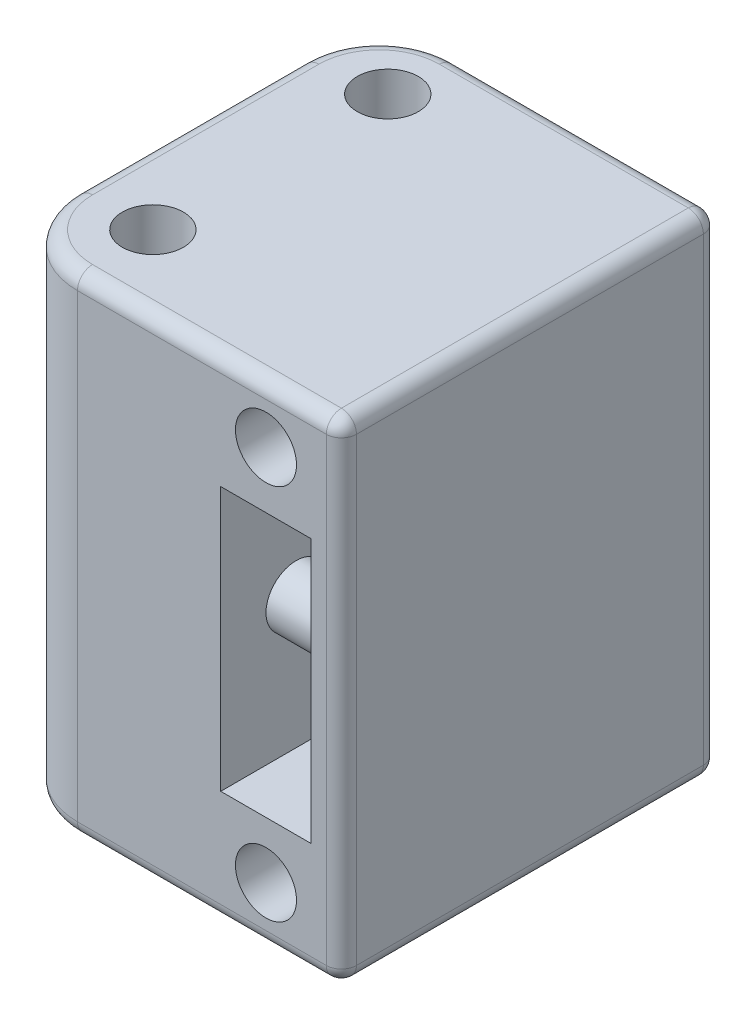
ISO-10303-21;
HEADER;
FILE_DESCRIPTION(('STEP AP214'),'2;1');
FILE_NAME('part.step','',(''),(''),'','','');
FILE_SCHEMA(('AUTOMOTIVE_DESIGN { 1 0 10303 214 1 1 1 1 }'));
ENDSEC;
DATA;
#1=APPLICATION_CONTEXT('core data for automotive mechanical design processes');
#2=APPLICATION_PROTOCOL_DEFINITION('international standard','automotive_design',2000,#1);
#3=PRODUCT_CONTEXT('',#1,'mechanical');
#4=PRODUCT('Part','Part','',(#3));
#5=PRODUCT_RELATED_PRODUCT_CATEGORY('part','',(#4));
#6=PRODUCT_DEFINITION_FORMATION('','',#4);
#7=PRODUCT_DEFINITION_CONTEXT('part definition',#1,'design');
#8=PRODUCT_DEFINITION('design','',#6,#7);
#9=PRODUCT_DEFINITION_SHAPE('','',#8);
#10=(LENGTH_UNIT() NAMED_UNIT(*) SI_UNIT(.MILLI.,.METRE.));
#11=(NAMED_UNIT(*) PLANE_ANGLE_UNIT() SI_UNIT($,.RADIAN.));
#12=(NAMED_UNIT(*) SI_UNIT($,.STERADIAN.) SOLID_ANGLE_UNIT());
#13=UNCERTAINTY_MEASURE_WITH_UNIT(LENGTH_MEASURE(1.E-05),#10,'distance_accuracy_value','');
#14=(GEOMETRIC_REPRESENTATION_CONTEXT(3) GLOBAL_UNCERTAINTY_ASSIGNED_CONTEXT((#13)) GLOBAL_UNIT_ASSIGNED_CONTEXT((#10,
#11,#12)) REPRESENTATION_CONTEXT('',''));
#15=CARTESIAN_POINT('',(0.,0.,0.));
#16=DIRECTION('',(0.,0.,1.));
#17=DIRECTION('',(1.,0.,0.));
#18=AXIS2_PLACEMENT_3D('',#15,#16,#17);
#19=CARTESIAN_POINT('',(0.,-65.,0.));
#20=DIRECTION('',(0.,1.,0.));
#21=DIRECTION('',(0.,0.,1.));
#22=AXIS2_PLACEMENT_3D('',#19,#20,#21);
#23=CYLINDRICAL_SURFACE('',#22,10.);
#24=DIRECTION('',(0.,1.,0.));
#25=VECTOR('',#24,1.);
#26=CARTESIAN_POINT('',(0.,-132.268120235369,-10.));
#27=LINE('',#26,#25);
#28=CARTESIAN_POINT('',(0.,-63.,-10.));
#29=VERTEX_POINT('',#28);
#30=CARTESIAN_POINT('',(0.,-9.99999999999998,-10.));
#31=VERTEX_POINT('',#30);
#32=EDGE_CURVE('E259',#29,#31,#27,.T.);
#33=ORIENTED_EDGE('',*,*,#32,.F.);
#34=CARTESIAN_POINT('',(0.,-63.,0.));
#35=DIRECTION('',(0.,1.,0.));
#36=DIRECTION('',(0.,0.,1.));
#37=AXIS2_PLACEMENT_3D('',#34,#35,#36);
#38=CIRCLE('',#37,10.);
#39=CARTESIAN_POINT('',(0.,-63.,10.));
#40=VERTEX_POINT('',#39);
#41=EDGE_CURVE('E312',#29,#40,#38,.T.);
#42=ORIENTED_EDGE('',*,*,#41,.T.);
#43=DIRECTION('',(0.,1.,0.));
#44=VECTOR('',#43,1.);
#45=CARTESIAN_POINT('',(0.,-10.,10.));
#46=LINE('',#45,#44);
#47=CARTESIAN_POINT('',(0.,-2.,10.));
#48=VERTEX_POINT('',#47);
#49=EDGE_CURVE('E270',#40,#48,#46,.T.);
#50=ORIENTED_EDGE('',*,*,#49,.T.);
#51=CARTESIAN_POINT('',(0.,-2.,0.));
#52=DIRECTION('',(0.,1.,0.));
#53=DIRECTION('',(0.,0.,1.));
#54=AXIS2_PLACEMENT_3D('',#51,#52,#53);
#55=CIRCLE('',#54,10.);
#56=CARTESIAN_POINT('',(-10.,-2.,0.));
#57=VERTEX_POINT('',#56);
#58=EDGE_CURVE('E310',#48,#57,#55,.F.);
#59=ORIENTED_EDGE('',*,*,#58,.T.);
#60=DIRECTION('',(0.,1.,0.));
#61=VECTOR('',#60,1.);
#62=CARTESIAN_POINT('',(-10.,-10.,0.));
#63=LINE('',#62,#61);
#64=CARTESIAN_POINT('',(-10.,-10.,0.));
#65=VERTEX_POINT('',#64);
#66=EDGE_CURVE('E271',#65,#57,#63,.T.);
#67=ORIENTED_EDGE('',*,*,#66,.F.);
#68=CARTESIAN_POINT('',(0.,-10.,0.));
#69=DIRECTION('',(0.,1.,0.));
#70=DIRECTION('',(0.,0.,1.));
#71=AXIS2_PLACEMENT_3D('',#68,#69,#70);
#72=CIRCLE('',#71,10.);
#73=EDGE_CURVE('E274',#65,#31,#72,.F.);
#74=ORIENTED_EDGE('',*,*,#73,.T.);
#75=EDGE_LOOP('',(#33,#42,#50,#59,#67,#74));
#76=FACE_BOUND('',#75,.T.);
#77=ADVANCED_FACE('F56',(#76),#23,.T.);
#78=CARTESIAN_POINT('',(0.,-65.,0.));
#79=DIRECTION('',(0.,1.,0.));
#80=DIRECTION('',(0.,0.,1.));
#81=AXIS2_PLACEMENT_3D('',#78,#79,#80);
#82=PLANE('',#81);
#83=DIRECTION('',(0.,0.,-1.));
#84=VECTOR('',#83,1.);
#85=CARTESIAN_POINT('',(17.,-65.,-39.9999999999999));
#86=LINE('',#85,#84);
#87=CARTESIAN_POINT('',(17.,-65.,-8.00000000000001));
#88=VERTEX_POINT('',#87);
#89=CARTESIAN_POINT('',(17.,-65.,-37.9999999999999));
#90=VERTEX_POINT('',#89);
#91=EDGE_CURVE('E303',#88,#90,#86,.T.);
#92=ORIENTED_EDGE('',*,*,#91,.T.);
#93=DIRECTION('',(1.,0.,0.));
#94=VECTOR('',#93,1.);
#95=CARTESIAN_POINT('',(35.,-65.,-38.));
#96=LINE('',#95,#94);
#97=CARTESIAN_POINT('',(33.,-65.,-38.));
#98=VERTEX_POINT('',#97);
#99=EDGE_CURVE('E305',#90,#98,#96,.T.);
#100=ORIENTED_EDGE('',*,*,#99,.T.);
#101=DIRECTION('',(0.,0.,1.));
#102=VECTOR('',#101,1.);
#103=CARTESIAN_POINT('',(33.,-65.,10.));
#104=LINE('',#103,#102);
#105=CARTESIAN_POINT('',(33.,-65.,8.00000000000001));
#106=VERTEX_POINT('',#105);
#107=EDGE_CURVE('E296',#98,#106,#104,.T.);
#108=ORIENTED_EDGE('',*,*,#107,.T.);
#109=DIRECTION('',(-1.,0.,0.));
#110=VECTOR('',#109,1.);
#111=CARTESIAN_POINT('',(0.,-65.,8.00000000000001));
#112=LINE('',#111,#110);
#113=CARTESIAN_POINT('',(0.,-65.,8.00000000000001));
#114=VERTEX_POINT('',#113);
#115=EDGE_CURVE('E294',#106,#114,#112,.T.);
#116=ORIENTED_EDGE('',*,*,#115,.T.);
#117=CARTESIAN_POINT('',(0.,-65.,0.));
#118=DIRECTION('',(0.,1.,0.));
#119=DIRECTION('',(0.,0.,1.));
#120=AXIS2_PLACEMENT_3D('',#117,#118,#119);
#121=CIRCLE('',#120,8.);
#122=CARTESIAN_POINT('',(0.,-65.,-8.00000000000001));
#123=VERTEX_POINT('',#122);
#124=EDGE_CURVE('E298',#114,#123,#121,.F.);
#125=ORIENTED_EDGE('',*,*,#124,.T.);
#126=DIRECTION('',(1.,0.,0.));
#127=VECTOR('',#126,1.);
#128=CARTESIAN_POINT('',(15.,-65.,-8.00000000000001));
#129=LINE('',#128,#127);
#130=EDGE_CURVE('E300',#123,#88,#129,.T.);
#131=ORIENTED_EDGE('',*,*,#130,.T.);
#132=EDGE_LOOP('',(#92,#100,#108,#116,#125,#131));
#133=FACE_BOUND('',#132,.T.);
#134=CARTESIAN_POINT('',(0.,-65.,0.));
#135=DIRECTION('',(0.,1.,0.));
#136=DIRECTION('',(0.,0.,1.));
#137=AXIS2_PLACEMENT_3D('',#134,#135,#136);
#138=CIRCLE('',#137,4.05);
#139=CARTESIAN_POINT('',(0.,-65.,4.05));
#140=VERTEX_POINT('',#139);
#141=EDGE_CURVE('E248',#140,#140,#138,.T.);
#142=ORIENTED_EDGE('',*,*,#141,.T.);
#143=EDGE_LOOP('',(#142));
#144=FACE_BOUND('',#143,.T.);
#145=ADVANCED_FACE('F425',(#133,#144),#82,.F.);
#146=CARTESIAN_POINT('',(0.,0.,0.));
#147=DIRECTION('',(0.,1.,0.));
#148=DIRECTION('',(0.,0.,1.));
#149=AXIS2_PLACEMENT_3D('',#146,#147,#148);
#150=PLANE('',#149);
#151=DIRECTION('',(0.,0.,-1.));
#152=VECTOR('',#151,1.);
#153=CARTESIAN_POINT('',(33.,0.,0.));
#154=LINE('',#153,#152);
#155=CARTESIAN_POINT('',(33.,0.,8.00000000000001));
#156=VERTEX_POINT('',#155);
#157=CARTESIAN_POINT('',(33.,0.,-38.));
#158=VERTEX_POINT('',#157);
#159=EDGE_CURVE('E314',#156,#158,#154,.T.);
#160=ORIENTED_EDGE('',*,*,#159,.T.);
#161=DIRECTION('',(-1.,0.,0.));
#162=VECTOR('',#161,1.);
#163=CARTESIAN_POINT('',(0.,0.,-38.));
#164=LINE('',#163,#162);
#165=CARTESIAN_POINT('',(0.,0.,-38.));
#166=VERTEX_POINT('',#165);
#167=EDGE_CURVE('E324',#158,#166,#164,.T.);
#168=ORIENTED_EDGE('',*,*,#167,.T.);
#169=CARTESIAN_POINT('',(0.,0.,-30.));
#170=DIRECTION('',(0.,1.,0.));
#171=DIRECTION('',(0.,0.,1.));
#172=AXIS2_PLACEMENT_3D('',#169,#170,#171);
#173=CIRCLE('',#172,8.);
#174=CARTESIAN_POINT('',(-8.,0.,-30.));
#175=VERTEX_POINT('',#174);
#176=EDGE_CURVE('E322',#166,#175,#173,.T.);
#177=ORIENTED_EDGE('',*,*,#176,.T.);
#178=DIRECTION('',(0.,0.,1.));
#179=VECTOR('',#178,1.);
#180=CARTESIAN_POINT('',(-8.,0.,0.));
#181=LINE('',#180,#179);
#182=CARTESIAN_POINT('',(-8.,0.,0.));
#183=VERTEX_POINT('',#182);
#184=EDGE_CURVE('E320',#175,#183,#181,.T.);
#185=ORIENTED_EDGE('',*,*,#184,.T.);
#186=CARTESIAN_POINT('',(0.,0.,0.));
#187=DIRECTION('',(0.,1.,0.));
#188=DIRECTION('',(0.,0.,1.));
#189=AXIS2_PLACEMENT_3D('',#186,#187,#188);
#190=CIRCLE('',#189,8.);
#191=CARTESIAN_POINT('',(0.,0.,8.00000000000001));
#192=VERTEX_POINT('',#191);
#193=EDGE_CURVE('E318',#183,#192,#190,.T.);
#194=ORIENTED_EDGE('',*,*,#193,.T.);
#195=DIRECTION('',(1.,0.,0.));
#196=VECTOR('',#195,1.);
#197=CARTESIAN_POINT('',(0.,0.,8.00000000000001));
#198=LINE('',#197,#196);
#199=EDGE_CURVE('E316',#192,#156,#198,.T.);
#200=ORIENTED_EDGE('',*,*,#199,.T.);
#201=EDGE_LOOP('',(#160,#168,#177,#185,#194,#200));
#202=FACE_BOUND('',#201,.T.);
#203=CARTESIAN_POINT('',(0.,0.,0.));
#204=DIRECTION('',(0.,1.,0.));
#205=DIRECTION('',(0.,0.,1.));
#206=AXIS2_PLACEMENT_3D('',#203,#204,#205);
#207=CIRCLE('',#206,4.05);
#208=CARTESIAN_POINT('',(0.,0.,4.05));
#209=VERTEX_POINT('',#208);
#210=EDGE_CURVE('E252',#209,#209,#207,.T.);
#211=ORIENTED_EDGE('',*,*,#210,.F.);
#212=EDGE_LOOP('',(#211));
#213=FACE_BOUND('',#212,.T.);
#214=CARTESIAN_POINT('',(0.,0.,-31.15));
#215=DIRECTION('',(0.,1.,0.));
#216=DIRECTION('',(0.,0.,1.));
#217=AXIS2_PLACEMENT_3D('',#214,#215,#216);
#218=CIRCLE('',#217,4.05);
#219=CARTESIAN_POINT('',(0.,0.,-27.1));
#220=VERTEX_POINT('',#219);
#221=EDGE_CURVE('E255',#220,#220,#218,.T.);
#222=ORIENTED_EDGE('',*,*,#221,.F.);
#223=EDGE_LOOP('',(#222));
#224=FACE_BOUND('',#223,.T.);
#225=ADVANCED_FACE('F431',(#202,#213,#224),#150,.T.);
#226=CARTESIAN_POINT('',(-10.,-10.,0.));
#227=DIRECTION('',(-1.,0.,0.));
#228=DIRECTION('',(0.,0.,1.));
#229=AXIS2_PLACEMENT_3D('',#226,#227,#228);
#230=PLANE('',#229);
#231=ORIENTED_EDGE('',*,*,#66,.T.);
#232=DIRECTION('',(0.,0.,1.));
#233=VECTOR('',#232,1.);
#234=CARTESIAN_POINT('',(-10.,-2.,0.));
#235=LINE('',#234,#233);
#236=CARTESIAN_POINT('',(-10.,-2.,-30.));
#237=VERTEX_POINT('',#236);
#238=EDGE_CURVE('E335',#57,#237,#235,.F.);
#239=ORIENTED_EDGE('',*,*,#238,.T.);
#240=DIRECTION('',(0.,1.,0.));
#241=VECTOR('',#240,1.);
#242=CARTESIAN_POINT('',(-10.,-10.,-30.));
#243=LINE('',#242,#241);
#244=CARTESIAN_POINT('',(-10.,-10.,-30.));
#245=VERTEX_POINT('',#244);
#246=EDGE_CURVE('E290',#237,#245,#243,.F.);
#247=ORIENTED_EDGE('',*,*,#246,.T.);
#248=DIRECTION('',(0.,0.,1.));
#249=VECTOR('',#248,1.);
#250=CARTESIAN_POINT('',(-10.,-10.,0.));
#251=LINE('',#250,#249);
#252=EDGE_CURVE('E268',#245,#65,#251,.T.);
#253=ORIENTED_EDGE('',*,*,#252,.T.);
#254=EDGE_LOOP('',(#231,#239,#247,#253));
#255=FACE_BOUND('',#254,.T.);
#256=ADVANCED_FACE('F523',(#255),#230,.T.);
#257=CARTESIAN_POINT('',(-10.,-10.,-40.));
#258=DIRECTION('',(0.,0.,-1.));
#259=DIRECTION('',(-1.,0.,0.));
#260=AXIS2_PLACEMENT_3D('',#257,#258,#259);
#261=PLANE('',#260);
#262=DIRECTION('',(1.,0.,0.));
#263=VECTOR('',#262,1.);
#264=CARTESIAN_POINT('',(19.,-15.,-40.));
#265=LINE('',#264,#263);
#266=CARTESIAN_POINT('',(19.,-15.,-40.));
#267=VERTEX_POINT('',#266);
#268=CARTESIAN_POINT('',(31.,-15.,-39.9999999999999));
#269=VERTEX_POINT('',#268);
#270=EDGE_CURVE('E71',#267,#269,#265,.T.);
#271=ORIENTED_EDGE('',*,*,#270,.F.);
#272=DIRECTION('',(0.,1.,0.));
#273=VECTOR('',#272,1.);
#274=CARTESIAN_POINT('',(19.,-50.,-40.));
#275=LINE('',#274,#273);
#276=CARTESIAN_POINT('',(19.,-50.,-40.));
#277=VERTEX_POINT('',#276);
#278=EDGE_CURVE('E217',#277,#267,#275,.T.);
#279=ORIENTED_EDGE('',*,*,#278,.F.);
#280=DIRECTION('',(-1.,0.,0.));
#281=VECTOR('',#280,1.);
#282=CARTESIAN_POINT('',(31.,-50.,-39.9999999999999));
#283=LINE('',#282,#281);
#284=CARTESIAN_POINT('',(31.,-50.,-39.9999999999999));
#285=VERTEX_POINT('',#284);
#286=EDGE_CURVE('E220',#285,#277,#283,.T.);
#287=ORIENTED_EDGE('',*,*,#286,.F.);
#288=DIRECTION('',(0.,-1.,0.));
#289=VECTOR('',#288,1.);
#290=CARTESIAN_POINT('',(31.,-15.,-39.9999999999999));
#291=LINE('',#290,#289);
#292=EDGE_CURVE('E226',#269,#285,#291,.T.);
#293=ORIENTED_EDGE('',*,*,#292,.F.);
#294=EDGE_LOOP('',(#271,#279,#287,#293));
#295=FACE_BOUND('',#294,.T.);
#296=CARTESIAN_POINT('',(24.9990855474541,-57.5,-40.));
#297=DIRECTION('',(0.,0.,-1.));
#298=DIRECTION('',(-1.,0.,0.));
#299=AXIS2_PLACEMENT_3D('',#296,#297,#298);
#300=CIRCLE('',#299,4.05);
#301=CARTESIAN_POINT('',(20.9490855474541,-57.5,-40.));
#302=VERTEX_POINT('',#301);
#303=EDGE_CURVE('E244',#302,#302,#300,.T.);
#304=ORIENTED_EDGE('',*,*,#303,.F.);
#305=EDGE_LOOP('',(#304));
#306=FACE_BOUND('',#305,.T.);
#307=CARTESIAN_POINT('',(24.9990855474541,-7.50000000000001,-40.));
#308=DIRECTION('',(0.,0.,-1.));
#309=DIRECTION('',(-1.,0.,0.));
#310=AXIS2_PLACEMENT_3D('',#307,#308,#309);
#311=CIRCLE('',#310,4.05);
#312=CARTESIAN_POINT('',(20.9490855474541,-7.50000000000001,-40.));
#313=VERTEX_POINT('',#312);
#314=EDGE_CURVE('E239',#313,#313,#311,.T.);
#315=ORIENTED_EDGE('',*,*,#314,.F.);
#316=EDGE_LOOP('',(#315));
#317=FACE_BOUND('',#316,.T.);
#318=DIRECTION('',(0.,1.,0.));
#319=VECTOR('',#318,1.);
#320=CARTESIAN_POINT('',(0.,-10.,-40.));
#321=LINE('',#320,#319);
#322=CARTESIAN_POINT('',(0.,-10.,-40.));
#323=VERTEX_POINT('',#322);
#324=CARTESIAN_POINT('',(0.,-2.,-40.));
#325=VERTEX_POINT('',#324);
#326=EDGE_CURVE('E285',#323,#325,#321,.T.);
#327=ORIENTED_EDGE('',*,*,#326,.T.);
#328=DIRECTION('',(-1.,0.,0.));
#329=VECTOR('',#328,1.);
#330=CARTESIAN_POINT('',(-10.,-2.,-40.));
#331=LINE('',#330,#329);
#332=CARTESIAN_POINT('',(33.,-2.,-40.));
#333=VERTEX_POINT('',#332);
#334=EDGE_CURVE('E331',#325,#333,#331,.F.);
#335=ORIENTED_EDGE('',*,*,#334,.T.);
#336=DIRECTION('',(0.,1.,0.));
#337=VECTOR('',#336,1.);
#338=CARTESIAN_POINT('',(33.,-10.,-40.));
#339=LINE('',#338,#337);
#340=CARTESIAN_POINT('',(33.,-63.,-40.));
#341=VERTEX_POINT('',#340);
#342=EDGE_CURVE('E329',#333,#341,#339,.F.);
#343=ORIENTED_EDGE('',*,*,#342,.T.);
#344=DIRECTION('',(1.,0.,0.));
#345=VECTOR('',#344,1.);
#346=CARTESIAN_POINT('',(15.,-63.,-40.));
#347=LINE('',#346,#345);
#348=CARTESIAN_POINT('',(15.,-63.,-39.9999999999999));
#349=VERTEX_POINT('',#348);
#350=EDGE_CURVE('E327',#341,#349,#347,.F.);
#351=ORIENTED_EDGE('',*,*,#350,.T.);
#352=DIRECTION('',(0.,1.,0.));
#353=VECTOR('',#352,1.);
#354=CARTESIAN_POINT('',(15.,-132.268120235369,-39.9999999999999));
#355=LINE('',#354,#353);
#356=CARTESIAN_POINT('',(15.,-9.99999999999998,-39.9999999999999));
#357=VERTEX_POINT('',#356);
#358=EDGE_CURVE('E264',#349,#357,#355,.T.);
#359=ORIENTED_EDGE('',*,*,#358,.T.);
#360=DIRECTION('',(-1.,0.,0.));
#361=VECTOR('',#360,1.);
#362=CARTESIAN_POINT('',(-10.,-10.,-40.));
#363=LINE('',#362,#361);
#364=EDGE_CURVE('E261',#357,#323,#363,.T.);
#365=ORIENTED_EDGE('',*,*,#364,.T.);
#366=EDGE_LOOP('',(#327,#335,#343,#351,#359,#365));
#367=FACE_BOUND('',#366,.T.);
#368=ADVANCED_FACE('F533',(#295,#306,#317,#367),#261,.T.);
#369=CARTESIAN_POINT('',(35.,-10.,-40.));
#370=DIRECTION('',(1.,0.,0.));
#371=DIRECTION('',(0.,0.,-1.));
#372=AXIS2_PLACEMENT_3D('',#369,#370,#371);
#373=PLANE('',#372);
#374=DIRECTION('',(0.,0.,1.));
#375=VECTOR('',#374,1.);
#376=CARTESIAN_POINT('',(35.,-63.,-40.));
#377=LINE('',#376,#375);
#378=CARTESIAN_POINT('',(35.,-63.,8.00000000000001));
#379=VERTEX_POINT('',#378);
#380=CARTESIAN_POINT('',(35.,-63.,-38.));
#381=VERTEX_POINT('',#380);
#382=EDGE_CURVE('E341',#379,#381,#377,.F.);
#383=ORIENTED_EDGE('',*,*,#382,.T.);
#384=DIRECTION('',(0.,1.,0.));
#385=VECTOR('',#384,1.);
#386=CARTESIAN_POINT('',(35.,-10.,-38.));
#387=LINE('',#386,#385);
#388=CARTESIAN_POINT('',(35.,-2.,-38.));
#389=VERTEX_POINT('',#388);
#390=EDGE_CURVE('E343',#381,#389,#387,.T.);
#391=ORIENTED_EDGE('',*,*,#390,.T.);
#392=DIRECTION('',(0.,0.,-1.));
#393=VECTOR('',#392,1.);
#394=CARTESIAN_POINT('',(35.,-2.,-40.));
#395=LINE('',#394,#393);
#396=CARTESIAN_POINT('',(35.,-2.,8.00000000000001));
#397=VERTEX_POINT('',#396);
#398=EDGE_CURVE('E339',#389,#397,#395,.F.);
#399=ORIENTED_EDGE('',*,*,#398,.T.);
#400=DIRECTION('',(0.,1.,0.));
#401=VECTOR('',#400,1.);
#402=CARTESIAN_POINT('',(35.,-10.,8.00000000000001));
#403=LINE('',#402,#401);
#404=EDGE_CURVE('E337',#397,#379,#403,.F.);
#405=ORIENTED_EDGE('',*,*,#404,.T.);
#406=EDGE_LOOP('',(#383,#391,#399,#405));
#407=FACE_BOUND('',#406,.T.);
#408=ADVANCED_FACE('F604',(#407),#373,.T.);
#409=CARTESIAN_POINT('',(0.,-10.,10.));
#410=DIRECTION('',(0.,0.,1.));
#411=DIRECTION('',(1.,0.,0.));
#412=AXIS2_PLACEMENT_3D('',#409,#410,#411);
#413=PLANE('',#412);
#414=DIRECTION('',(1.,0.,0.));
#415=VECTOR('',#414,1.);
#416=CARTESIAN_POINT('',(19.,-15.,10.));
#417=LINE('',#416,#415);
#418=CARTESIAN_POINT('',(19.,-15.,10.));
#419=VERTEX_POINT('',#418);
#420=CARTESIAN_POINT('',(31.,-15.,10.));
#421=VERTEX_POINT('',#420);
#422=EDGE_CURVE('E201',#419,#421,#417,.T.);
#423=ORIENTED_EDGE('',*,*,#422,.T.);
#424=DIRECTION('',(0.,-1.,0.));
#425=VECTOR('',#424,1.);
#426=CARTESIAN_POINT('',(31.,-15.,10.));
#427=LINE('',#426,#425);
#428=CARTESIAN_POINT('',(31.,-50.,10.));
#429=VERTEX_POINT('',#428);
#430=EDGE_CURVE('E210',#421,#429,#427,.T.);
#431=ORIENTED_EDGE('',*,*,#430,.T.);
#432=DIRECTION('',(-1.,0.,0.));
#433=VECTOR('',#432,1.);
#434=CARTESIAN_POINT('',(31.,-50.,10.));
#435=LINE('',#434,#433);
#436=CARTESIAN_POINT('',(19.,-50.,10.));
#437=VERTEX_POINT('',#436);
#438=EDGE_CURVE('E79',#429,#437,#435,.T.);
#439=ORIENTED_EDGE('',*,*,#438,.T.);
#440=DIRECTION('',(0.,1.,0.));
#441=VECTOR('',#440,1.);
#442=CARTESIAN_POINT('',(19.,-50.,10.));
#443=LINE('',#442,#441);
#444=EDGE_CURVE('E207',#437,#419,#443,.T.);
#445=ORIENTED_EDGE('',*,*,#444,.T.);
#446=EDGE_LOOP('',(#423,#431,#439,#445));
#447=FACE_BOUND('',#446,.T.);
#448=CARTESIAN_POINT('',(24.9990855474541,-57.5,9.9999999999999));
#449=DIRECTION('',(0.,0.,-1.));
#450=DIRECTION('',(-1.,0.,0.));
#451=AXIS2_PLACEMENT_3D('',#448,#449,#450);
#452=CIRCLE('',#451,4.05);
#453=CARTESIAN_POINT('',(20.9490855474541,-57.5,9.9999999999999));
#454=VERTEX_POINT('',#453);
#455=EDGE_CURVE('E236',#454,#454,#452,.T.);
#456=ORIENTED_EDGE('',*,*,#455,.T.);
#457=EDGE_LOOP('',(#456));
#458=FACE_BOUND('',#457,.T.);
#459=CARTESIAN_POINT('',(24.9990855474541,-7.50000000000001,9.9999999999999));
#460=DIRECTION('',(0.,0.,-1.));
#461=DIRECTION('',(-1.,0.,0.));
#462=AXIS2_PLACEMENT_3D('',#459,#460,#461);
#463=CIRCLE('',#462,4.05);
#464=CARTESIAN_POINT('',(20.9490855474541,-7.50000000000001,9.9999999999999));
#465=VERTEX_POINT('',#464);
#466=EDGE_CURVE('E232',#465,#465,#463,.T.);
#467=ORIENTED_EDGE('',*,*,#466,.T.);
#468=EDGE_LOOP('',(#467));
#469=FACE_BOUND('',#468,.T.);
#470=ORIENTED_EDGE('',*,*,#49,.F.);
#471=DIRECTION('',(-1.,0.,0.));
#472=VECTOR('',#471,1.);
#473=CARTESIAN_POINT('',(35.,-63.,10.));
#474=LINE('',#473,#472);
#475=CARTESIAN_POINT('',(33.,-63.,10.));
#476=VERTEX_POINT('',#475);
#477=EDGE_CURVE('E352',#40,#476,#474,.F.);
#478=ORIENTED_EDGE('',*,*,#477,.T.);
#479=DIRECTION('',(0.,1.,0.));
#480=VECTOR('',#479,1.);
#481=CARTESIAN_POINT('',(33.,-10.,10.));
#482=LINE('',#481,#480);
#483=CARTESIAN_POINT('',(33.,-2.,10.));
#484=VERTEX_POINT('',#483);
#485=EDGE_CURVE('E348',#476,#484,#482,.T.);
#486=ORIENTED_EDGE('',*,*,#485,.T.);
#487=DIRECTION('',(1.,0.,0.));
#488=VECTOR('',#487,1.);
#489=CARTESIAN_POINT('',(0.,-2.,10.));
#490=LINE('',#489,#488);
#491=EDGE_CURVE('E350',#484,#48,#490,.F.);
#492=ORIENTED_EDGE('',*,*,#491,.T.);
#493=EDGE_LOOP('',(#470,#478,#486,#492));
#494=FACE_BOUND('',#493,.T.);
#495=ADVANCED_FACE('F214',(#447,#458,#469,#494),#413,.T.);
#496=CARTESIAN_POINT('',(0.,-10.,0.));
#497=DIRECTION('',(0.,1.,0.));
#498=DIRECTION('',(0.,0.,1.));
#499=AXIS2_PLACEMENT_3D('',#496,#497,#498);
#500=PLANE('',#499);
#501=CARTESIAN_POINT('',(0.,-10.,-31.15));
#502=DIRECTION('',(0.,1.,0.));
#503=DIRECTION('',(0.,0.,1.));
#504=AXIS2_PLACEMENT_3D('',#501,#502,#503);
#505=CIRCLE('',#504,4.05);
#506=CARTESIAN_POINT('',(0.,-10.,-27.1));
#507=VERTEX_POINT('',#506);
#508=EDGE_CURVE('E251',#507,#507,#505,.T.);
#509=ORIENTED_EDGE('',*,*,#508,.T.);
#510=EDGE_LOOP('',(#509));
#511=FACE_BOUND('',#510,.T.);
#512=ORIENTED_EDGE('',*,*,#252,.F.);
#513=CARTESIAN_POINT('',(0.,-10.,-30.));
#514=DIRECTION('',(0.,1.,0.));
#515=DIRECTION('',(0.,0.,1.));
#516=AXIS2_PLACEMENT_3D('',#513,#514,#515);
#517=CIRCLE('',#516,10.);
#518=EDGE_CURVE('E292',#245,#323,#517,.F.);
#519=ORIENTED_EDGE('',*,*,#518,.T.);
#520=ORIENTED_EDGE('',*,*,#364,.F.);
#521=DIRECTION('',(0.,0.,1.));
#522=VECTOR('',#521,1.);
#523=CARTESIAN_POINT('',(15.,-10.,0.));
#524=LINE('',#523,#522);
#525=CARTESIAN_POINT('',(15.,-9.99999999999998,-10.));
#526=VERTEX_POINT('',#525);
#527=EDGE_CURVE('E279',#357,#526,#524,.T.);
#528=ORIENTED_EDGE('',*,*,#527,.T.);
#529=DIRECTION('',(-1.,0.,0.));
#530=VECTOR('',#529,1.);
#531=CARTESIAN_POINT('',(0.,-10.,-10.));
#532=LINE('',#531,#530);
#533=EDGE_CURVE('E282',#526,#31,#532,.T.);
#534=ORIENTED_EDGE('',*,*,#533,.T.);
#535=ORIENTED_EDGE('',*,*,#73,.F.);
#536=EDGE_LOOP('',(#512,#519,#520,#528,#534,#535));
#537=FACE_BOUND('',#536,.T.);
#538=ADVANCED_FACE('F530',(#511,#537),#500,.F.);
#539=CARTESIAN_POINT('',(0.,-132.268120235369,-10.));
#540=DIRECTION('',(0.,0.,-1.));
#541=DIRECTION('',(-1.,0.,0.));
#542=AXIS2_PLACEMENT_3D('',#539,#540,#541);
#543=PLANE('',#542);
#544=DIRECTION('',(0.,1.,0.));
#545=VECTOR('',#544,1.);
#546=CARTESIAN_POINT('',(15.,-132.268120235369,-10.));
#547=LINE('',#546,#545);
#548=CARTESIAN_POINT('',(15.,-63.,-10.));
#549=VERTEX_POINT('',#548);
#550=EDGE_CURVE('E262',#549,#526,#547,.T.);
#551=ORIENTED_EDGE('',*,*,#550,.F.);
#552=DIRECTION('',(1.,0.,0.));
#553=VECTOR('',#552,1.);
#554=CARTESIAN_POINT('',(0.,-63.,-10.));
#555=LINE('',#554,#553);
#556=EDGE_CURVE('E307',#549,#29,#555,.F.);
#557=ORIENTED_EDGE('',*,*,#556,.T.);
#558=ORIENTED_EDGE('',*,*,#32,.T.);
#559=ORIENTED_EDGE('',*,*,#533,.F.);
#560=EDGE_LOOP('',(#551,#557,#558,#559));
#561=FACE_BOUND('',#560,.T.);
#562=ADVANCED_FACE('F586',(#561),#543,.T.);
#563=CARTESIAN_POINT('',(15.,-132.268120235369,-39.9999999999999));
#564=DIRECTION('',(-1.,0.,0.));
#565=DIRECTION('',(0.,0.,1.));
#566=AXIS2_PLACEMENT_3D('',#563,#564,#565);
#567=PLANE('',#566);
#568=ORIENTED_EDGE('',*,*,#358,.F.);
#569=DIRECTION('',(0.,0.,-1.));
#570=VECTOR('',#569,1.);
#571=CARTESIAN_POINT('',(15.,-63.,-10.));
#572=LINE('',#571,#570);
#573=EDGE_CURVE('E346',#349,#549,#572,.F.);
#574=ORIENTED_EDGE('',*,*,#573,.T.);
#575=ORIENTED_EDGE('',*,*,#550,.T.);
#576=ORIENTED_EDGE('',*,*,#527,.F.);
#577=EDGE_LOOP('',(#568,#574,#575,#576));
#578=FACE_BOUND('',#577,.T.);
#579=ADVANCED_FACE('F540',(#578),#567,.T.);
#580=CARTESIAN_POINT('',(0.,-65.,-31.15));
#581=DIRECTION('',(0.,1.,0.));
#582=DIRECTION('',(0.,0.,1.));
#583=AXIS2_PLACEMENT_3D('',#580,#581,#582);
#584=CYLINDRICAL_SURFACE('',#583,4.05);
#585=ORIENTED_EDGE('',*,*,#221,.T.);
#586=EDGE_LOOP('',(#585));
#587=FACE_BOUND('',#586,.T.);
#588=ORIENTED_EDGE('',*,*,#508,.F.);
#589=EDGE_LOOP('',(#588));
#590=FACE_BOUND('',#589,.T.);
#591=ADVANCED_FACE('F593',(#587,#590),#584,.F.);
#592=CARTESIAN_POINT('',(0.,-65.,0.));
#593=DIRECTION('',(0.,1.,0.));
#594=DIRECTION('',(0.,0.,1.));
#595=AXIS2_PLACEMENT_3D('',#592,#593,#594);
#596=CYLINDRICAL_SURFACE('',#595,4.05);
#597=ORIENTED_EDGE('',*,*,#141,.F.);
#598=EDGE_LOOP('',(#597));
#599=FACE_BOUND('',#598,.T.);
#600=ORIENTED_EDGE('',*,*,#210,.T.);
#601=EDGE_LOOP('',(#600));
#602=FACE_BOUND('',#601,.T.);
#603=ADVANCED_FACE('F440',(#599,#602),#596,.F.);
#604=CARTESIAN_POINT('',(0.,-10.,-30.));
#605=DIRECTION('',(0.,1.,0.));
#606=DIRECTION('',(0.,0.,1.));
#607=AXIS2_PLACEMENT_3D('',#604,#605,#606);
#608=CYLINDRICAL_SURFACE('',#607,10.);
#609=ORIENTED_EDGE('',*,*,#246,.F.);
#610=CARTESIAN_POINT('',(0.,-2.,-30.));
#611=DIRECTION('',(0.,1.,0.));
#612=DIRECTION('',(0.,0.,1.));
#613=AXIS2_PLACEMENT_3D('',#610,#611,#612);
#614=CIRCLE('',#613,10.);
#615=EDGE_CURVE('E333',#237,#325,#614,.F.);
#616=ORIENTED_EDGE('',*,*,#615,.T.);
#617=ORIENTED_EDGE('',*,*,#326,.F.);
#618=ORIENTED_EDGE('',*,*,#518,.F.);
#619=EDGE_LOOP('',(#609,#616,#617,#618));
#620=FACE_BOUND('',#619,.T.);
#621=ADVANCED_FACE('F437',(#620),#608,.T.);
#622=CARTESIAN_POINT('',(-8.,-2.,0.));
#623=DIRECTION('',(0.,0.,1.));
#624=DIRECTION('',(1.,0.,0.));
#625=AXIS2_PLACEMENT_3D('',#622,#623,#624);
#626=CYLINDRICAL_SURFACE('',#625,2.);
#627=CARTESIAN_POINT('',(-8.,-2.,-30.));
#628=DIRECTION('',(0.,0.,-1.));
#629=DIRECTION('',(-1.,0.,0.));
#630=AXIS2_PLACEMENT_3D('',#627,#628,#629);
#631=CIRCLE('',#630,2.);
#632=EDGE_CURVE('E403',#237,#175,#631,.T.);
#633=ORIENTED_EDGE('',*,*,#632,.F.);
#634=ORIENTED_EDGE('',*,*,#238,.F.);
#635=CARTESIAN_POINT('',(-8.,-2.,0.));
#636=DIRECTION('',(0.,0.,1.));
#637=DIRECTION('',(1.,0.,0.));
#638=AXIS2_PLACEMENT_3D('',#635,#636,#637);
#639=CIRCLE('',#638,2.);
#640=EDGE_CURVE('E258',#183,#57,#639,.T.);
#641=ORIENTED_EDGE('',*,*,#640,.F.);
#642=ORIENTED_EDGE('',*,*,#184,.F.);
#643=EDGE_LOOP('',(#633,#634,#641,#642));
#644=FACE_BOUND('',#643,.T.);
#645=ADVANCED_FACE('F58',(#644),#626,.T.);
#646=CARTESIAN_POINT('',(0.,-2.,0.));
#647=DIRECTION('',(0.,1.,0.));
#648=DIRECTION('',(0.,0.,1.));
#649=AXIS2_PLACEMENT_3D('',#646,#647,#648);
#650=TOROIDAL_SURFACE('',#649,8.,2.);
#651=ORIENTED_EDGE('',*,*,#640,.T.);
#652=ORIENTED_EDGE('',*,*,#58,.F.);
#653=CARTESIAN_POINT('',(0.,-2.,8.00000000000001));
#654=DIRECTION('',(1.,0.,0.));
#655=DIRECTION('',(0.,0.,-1.));
#656=AXIS2_PLACEMENT_3D('',#653,#654,#655);
#657=CIRCLE('',#656,2.);
#658=EDGE_CURVE('E400',#192,#48,#657,.T.);
#659=ORIENTED_EDGE('',*,*,#658,.F.);
#660=ORIENTED_EDGE('',*,*,#193,.F.);
#661=EDGE_LOOP('',(#651,#652,#659,#660));
#662=FACE_BOUND('',#661,.T.);
#663=ADVANCED_FACE('F505',(#662),#650,.T.);
#664=CARTESIAN_POINT('',(0.,-2.,-30.));
#665=DIRECTION('',(0.,1.,0.));
#666=DIRECTION('',(0.,0.,1.));
#667=AXIS2_PLACEMENT_3D('',#664,#665,#666);
#668=TOROIDAL_SURFACE('',#667,8.,2.);
#669=ORIENTED_EDGE('',*,*,#632,.T.);
#670=ORIENTED_EDGE('',*,*,#176,.F.);
#671=CARTESIAN_POINT('',(0.,-2.,-38.));
#672=DIRECTION('',(1.,0.,0.));
#673=DIRECTION('',(0.,0.,-1.));
#674=AXIS2_PLACEMENT_3D('',#671,#672,#673);
#675=CIRCLE('',#674,2.);
#676=EDGE_CURVE('E398',#325,#166,#675,.T.);
#677=ORIENTED_EDGE('',*,*,#676,.F.);
#678=ORIENTED_EDGE('',*,*,#615,.F.);
#679=EDGE_LOOP('',(#669,#670,#677,#678));
#680=FACE_BOUND('',#679,.T.);
#681=ADVANCED_FACE('F502',(#680),#668,.T.);
#682=CARTESIAN_POINT('',(0.,-2.,8.00000000000001));
#683=DIRECTION('',(1.,0.,0.));
#684=DIRECTION('',(0.,0.,-1.));
#685=AXIS2_PLACEMENT_3D('',#682,#683,#684);
#686=CYLINDRICAL_SURFACE('',#685,2.);
#687=ORIENTED_EDGE('',*,*,#658,.T.);
#688=ORIENTED_EDGE('',*,*,#491,.F.);
#689=CARTESIAN_POINT('',(33.,-2.,8.00000000000001));
#690=DIRECTION('',(1.,0.,0.));
#691=DIRECTION('',(0.,0.,-1.));
#692=AXIS2_PLACEMENT_3D('',#689,#690,#691);
#693=CIRCLE('',#692,2.);
#694=EDGE_CURVE('E395',#156,#484,#693,.T.);
#695=ORIENTED_EDGE('',*,*,#694,.F.);
#696=ORIENTED_EDGE('',*,*,#199,.F.);
#697=EDGE_LOOP('',(#687,#688,#695,#696));
#698=FACE_BOUND('',#697,.T.);
#699=ADVANCED_FACE('F498',(#698),#686,.T.);
#700=CARTESIAN_POINT('',(33.,-2.,0.));
#701=DIRECTION('',(0.,0.,-1.));
#702=DIRECTION('',(-1.,0.,0.));
#703=AXIS2_PLACEMENT_3D('',#700,#701,#702);
#704=CYLINDRICAL_SURFACE('',#703,2.);
#705=CARTESIAN_POINT('',(33.,-2.,-38.));
#706=DIRECTION('',(0.,0.,-1.));
#707=DIRECTION('',(-1.,0.,0.));
#708=AXIS2_PLACEMENT_3D('',#705,#706,#707);
#709=CIRCLE('',#708,2.);
#710=EDGE_CURVE('E389',#158,#389,#709,.T.);
#711=ORIENTED_EDGE('',*,*,#710,.F.);
#712=ORIENTED_EDGE('',*,*,#159,.F.);
#713=CARTESIAN_POINT('',(33.,-2.,8.00000000000001));
#714=DIRECTION('',(0.,0.,1.));
#715=DIRECTION('',(1.,0.,0.));
#716=AXIS2_PLACEMENT_3D('',#713,#714,#715);
#717=CIRCLE('',#716,2.);
#718=EDGE_CURVE('E392',#397,#156,#717,.T.);
#719=ORIENTED_EDGE('',*,*,#718,.F.);
#720=ORIENTED_EDGE('',*,*,#398,.F.);
#721=EDGE_LOOP('',(#711,#712,#719,#720));
#722=FACE_BOUND('',#721,.T.);
#723=ADVANCED_FACE('F494',(#722),#704,.T.);
#724=CARTESIAN_POINT('',(0.,-2.,-38.));
#725=DIRECTION('',(-1.,0.,0.));
#726=DIRECTION('',(0.,0.,1.));
#727=AXIS2_PLACEMENT_3D('',#724,#725,#726);
#728=CYLINDRICAL_SURFACE('',#727,2.);
#729=ORIENTED_EDGE('',*,*,#676,.T.);
#730=ORIENTED_EDGE('',*,*,#167,.F.);
#731=CARTESIAN_POINT('',(33.,-2.,-38.));
#732=DIRECTION('',(1.,0.,0.));
#733=DIRECTION('',(0.,0.,-1.));
#734=AXIS2_PLACEMENT_3D('',#731,#732,#733);
#735=CIRCLE('',#734,2.);
#736=EDGE_CURVE('E386',#333,#158,#735,.T.);
#737=ORIENTED_EDGE('',*,*,#736,.F.);
#738=ORIENTED_EDGE('',*,*,#334,.F.);
#739=EDGE_LOOP('',(#729,#730,#737,#738));
#740=FACE_BOUND('',#739,.T.);
#741=ADVANCED_FACE('F490',(#740),#728,.T.);
#742=CARTESIAN_POINT('',(33.,-2.,8.00000000000001));
#743=DIRECTION('',(0.,0.,1.));
#744=DIRECTION('',(1.,0.,0.));
#745=AXIS2_PLACEMENT_3D('',#742,#743,#744);
#746=SPHERICAL_SURFACE('',#745,2.);
#747=ORIENTED_EDGE('',*,*,#718,.T.);
#748=ORIENTED_EDGE('',*,*,#694,.T.);
#749=CARTESIAN_POINT('',(33.,-2.,8.00000000000001));
#750=DIRECTION('',(0.,1.,0.));
#751=DIRECTION('',(0.,0.,1.));
#752=AXIS2_PLACEMENT_3D('',#749,#750,#751);
#753=CIRCLE('',#752,2.);
#754=EDGE_CURVE('E383',#397,#484,#753,.F.);
#755=ORIENTED_EDGE('',*,*,#754,.F.);
#756=EDGE_LOOP('',(#747,#748,#755));
#757=FACE_BOUND('',#756,.T.);
#758=ADVANCED_FACE('F486',(#757),#746,.T.);
#759=CARTESIAN_POINT('',(33.,-2.,-38.));
#760=DIRECTION('',(0.,0.,1.));
#761=DIRECTION('',(1.,0.,0.));
#762=AXIS2_PLACEMENT_3D('',#759,#760,#761);
#763=SPHERICAL_SURFACE('',#762,2.);
#764=ORIENTED_EDGE('',*,*,#736,.T.);
#765=ORIENTED_EDGE('',*,*,#710,.T.);
#766=CARTESIAN_POINT('',(33.,-2.,-38.));
#767=DIRECTION('',(0.,1.,0.));
#768=DIRECTION('',(0.,0.,1.));
#769=AXIS2_PLACEMENT_3D('',#766,#767,#768);
#770=CIRCLE('',#769,2.);
#771=EDGE_CURVE('E381',#333,#389,#770,.F.);
#772=ORIENTED_EDGE('',*,*,#771,.F.);
#773=EDGE_LOOP('',(#764,#765,#772));
#774=FACE_BOUND('',#773,.T.);
#775=ADVANCED_FACE('F482',(#774),#763,.T.);
#776=CARTESIAN_POINT('',(33.,-10.,8.00000000000001));
#777=DIRECTION('',(0.,1.,0.));
#778=DIRECTION('',(0.,0.,1.));
#779=AXIS2_PLACEMENT_3D('',#776,#777,#778);
#780=CYLINDRICAL_SURFACE('',#779,2.);
#781=ORIENTED_EDGE('',*,*,#754,.T.);
#782=ORIENTED_EDGE('',*,*,#485,.F.);
#783=CARTESIAN_POINT('',(33.,-63.,8.00000000000001));
#784=DIRECTION('',(0.,-1.,0.));
#785=DIRECTION('',(0.,0.,-1.));
#786=AXIS2_PLACEMENT_3D('',#783,#784,#785);
#787=CIRCLE('',#786,2.);
#788=EDGE_CURVE('E378',#379,#476,#787,.T.);
#789=ORIENTED_EDGE('',*,*,#788,.F.);
#790=ORIENTED_EDGE('',*,*,#404,.F.);
#791=EDGE_LOOP('',(#781,#782,#789,#790));
#792=FACE_BOUND('',#791,.T.);
#793=ADVANCED_FACE('F478',(#792),#780,.T.);
#794=CARTESIAN_POINT('',(33.,-63.,0.));
#795=DIRECTION('',(0.,0.,-1.));
#796=DIRECTION('',(-1.,0.,0.));
#797=AXIS2_PLACEMENT_3D('',#794,#795,#796);
#798=CYLINDRICAL_SURFACE('',#797,2.);
#799=CARTESIAN_POINT('',(33.,-63.,-38.));
#800=DIRECTION('',(0.,0.,-1.));
#801=DIRECTION('',(-1.,0.,0.));
#802=AXIS2_PLACEMENT_3D('',#799,#800,#801);
#803=CIRCLE('',#802,2.);
#804=EDGE_CURVE('E372',#381,#98,#803,.T.);
#805=ORIENTED_EDGE('',*,*,#804,.F.);
#806=ORIENTED_EDGE('',*,*,#382,.F.);
#807=CARTESIAN_POINT('',(33.,-63.,8.00000000000001));
#808=DIRECTION('',(0.,0.,1.));
#809=DIRECTION('',(1.,0.,0.));
#810=AXIS2_PLACEMENT_3D('',#807,#808,#809);
#811=CIRCLE('',#810,2.);
#812=EDGE_CURVE('E375',#106,#379,#811,.T.);
#813=ORIENTED_EDGE('',*,*,#812,.F.);
#814=ORIENTED_EDGE('',*,*,#107,.F.);
#815=EDGE_LOOP('',(#805,#806,#813,#814));
#816=FACE_BOUND('',#815,.T.);
#817=ADVANCED_FACE('F474',(#816),#798,.T.);
#818=CARTESIAN_POINT('',(33.,-10.,-38.));
#819=DIRECTION('',(0.,1.,0.));
#820=DIRECTION('',(0.,0.,1.));
#821=AXIS2_PLACEMENT_3D('',#818,#819,#820);
#822=CYLINDRICAL_SURFACE('',#821,2.);
#823=ORIENTED_EDGE('',*,*,#771,.T.);
#824=ORIENTED_EDGE('',*,*,#390,.F.);
#825=CARTESIAN_POINT('',(33.,-63.,-38.));
#826=DIRECTION('',(0.,-1.,0.));
#827=DIRECTION('',(0.,0.,-1.));
#828=AXIS2_PLACEMENT_3D('',#825,#826,#827);
#829=CIRCLE('',#828,2.);
#830=EDGE_CURVE('E369',#341,#381,#829,.T.);
#831=ORIENTED_EDGE('',*,*,#830,.F.);
#832=ORIENTED_EDGE('',*,*,#342,.F.);
#833=EDGE_LOOP('',(#823,#824,#831,#832));
#834=FACE_BOUND('',#833,.T.);
#835=ADVANCED_FACE('F470',(#834),#822,.T.);
#836=CARTESIAN_POINT('',(33.,-63.,8.00000000000001));
#837=DIRECTION('',(0.,0.,1.));
#838=DIRECTION('',(1.,0.,0.));
#839=AXIS2_PLACEMENT_3D('',#836,#837,#838);
#840=SPHERICAL_SURFACE('',#839,2.);
#841=ORIENTED_EDGE('',*,*,#812,.T.);
#842=ORIENTED_EDGE('',*,*,#788,.T.);
#843=CARTESIAN_POINT('',(33.,-63.,8.00000000000001));
#844=DIRECTION('',(1.,0.,0.));
#845=DIRECTION('',(0.,0.,-1.));
#846=AXIS2_PLACEMENT_3D('',#843,#844,#845);
#847=CIRCLE('',#846,2.);
#848=EDGE_CURVE('E366',#106,#476,#847,.F.);
#849=ORIENTED_EDGE('',*,*,#848,.F.);
#850=EDGE_LOOP('',(#841,#842,#849));
#851=FACE_BOUND('',#850,.T.);
#852=ADVANCED_FACE('F466',(#851),#840,.T.);
#853=CARTESIAN_POINT('',(33.,-63.,-38.));
#854=DIRECTION('',(0.,0.,1.));
#855=DIRECTION('',(1.,0.,0.));
#856=AXIS2_PLACEMENT_3D('',#853,#854,#855);
#857=SPHERICAL_SURFACE('',#856,2.);
#858=ORIENTED_EDGE('',*,*,#830,.T.);
#859=ORIENTED_EDGE('',*,*,#804,.T.);
#860=CARTESIAN_POINT('',(33.,-63.,-38.));
#861=DIRECTION('',(1.,0.,0.));
#862=DIRECTION('',(0.,0.,-1.));
#863=AXIS2_PLACEMENT_3D('',#860,#861,#862);
#864=CIRCLE('',#863,2.);
#865=EDGE_CURVE('E363',#341,#98,#864,.F.);
#866=ORIENTED_EDGE('',*,*,#865,.F.);
#867=EDGE_LOOP('',(#858,#859,#866));
#868=FACE_BOUND('',#867,.T.);
#869=ADVANCED_FACE('F462',(#868),#857,.T.);
#870=CARTESIAN_POINT('',(0.,-63.,8.00000000000001));
#871=DIRECTION('',(1.,0.,0.));
#872=DIRECTION('',(0.,0.,-1.));
#873=AXIS2_PLACEMENT_3D('',#870,#871,#872);
#874=CYLINDRICAL_SURFACE('',#873,2.);
#875=ORIENTED_EDGE('',*,*,#848,.T.);
#876=ORIENTED_EDGE('',*,*,#477,.F.);
#877=CARTESIAN_POINT('',(0.,-63.,8.00000000000001));
#878=DIRECTION('',(-1.,0.,0.));
#879=DIRECTION('',(0.,0.,1.));
#880=AXIS2_PLACEMENT_3D('',#877,#878,#879);
#881=CIRCLE('',#880,2.);
#882=EDGE_CURVE('E360',#114,#40,#881,.T.);
#883=ORIENTED_EDGE('',*,*,#882,.F.);
#884=ORIENTED_EDGE('',*,*,#115,.F.);
#885=EDGE_LOOP('',(#875,#876,#883,#884));
#886=FACE_BOUND('',#885,.T.);
#887=ADVANCED_FACE('F458',(#886),#874,.T.);
#888=CARTESIAN_POINT('',(0.,-63.,-38.));
#889=DIRECTION('',(-1.,0.,0.));
#890=DIRECTION('',(0.,0.,1.));
#891=AXIS2_PLACEMENT_3D('',#888,#889,#890);
#892=CYLINDRICAL_SURFACE('',#891,2.);
#893=ORIENTED_EDGE('',*,*,#865,.T.);
#894=ORIENTED_EDGE('',*,*,#99,.F.);
#895=CARTESIAN_POINT('',(17.,-63.,-37.9999999999999));
#896=DIRECTION('',(-0.707106781186547,0.,0.707106781186548));
#897=DIRECTION('',(0.707106781186548,0.,0.707106781186547));
#898=AXIS2_PLACEMENT_3D('',#895,#896,#897);
#899=ELLIPSE('',#898,2.82842712474619,2.);
#900=EDGE_CURVE('E357',#349,#90,#899,.T.);
#901=ORIENTED_EDGE('',*,*,#900,.F.);
#902=ORIENTED_EDGE('',*,*,#350,.F.);
#903=EDGE_LOOP('',(#893,#894,#901,#902));
#904=FACE_BOUND('',#903,.T.);
#905=ADVANCED_FACE('F454',(#904),#892,.T.);
#906=CARTESIAN_POINT('',(0.,-63.,0.));
#907=DIRECTION('',(0.,1.,0.));
#908=DIRECTION('',(0.,0.,1.));
#909=AXIS2_PLACEMENT_3D('',#906,#907,#908);
#910=TOROIDAL_SURFACE('',#909,8.,2.);
#911=ORIENTED_EDGE('',*,*,#882,.T.);
#912=ORIENTED_EDGE('',*,*,#41,.F.);
#913=CARTESIAN_POINT('',(0.,-63.,-8.00000000000001));
#914=DIRECTION('',(1.,0.,0.));
#915=DIRECTION('',(0.,0.,-1.));
#916=AXIS2_PLACEMENT_3D('',#913,#914,#915);
#917=CIRCLE('',#916,2.);
#918=EDGE_CURVE('E355',#123,#29,#917,.T.);
#919=ORIENTED_EDGE('',*,*,#918,.F.);
#920=ORIENTED_EDGE('',*,*,#124,.F.);
#921=EDGE_LOOP('',(#911,#912,#919,#920));
#922=FACE_BOUND('',#921,.T.);
#923=ADVANCED_FACE('F450',(#922),#910,.T.);
#924=CARTESIAN_POINT('',(17.,-63.,0.));
#925=DIRECTION('',(0.,0.,1.));
#926=DIRECTION('',(1.,0.,0.));
#927=AXIS2_PLACEMENT_3D('',#924,#925,#926);
#928=CYLINDRICAL_SURFACE('',#927,2.);
#929=ORIENTED_EDGE('',*,*,#900,.T.);
#930=ORIENTED_EDGE('',*,*,#91,.F.);
#931=CARTESIAN_POINT('',(17.,-63.,-8.00000000000001));
#932=DIRECTION('',(-0.707106781186547,0.,0.707106781186548));
#933=DIRECTION('',(-0.707106781186548,0.,-0.707106781186547));
#934=AXIS2_PLACEMENT_3D('',#931,#932,#933);
#935=ELLIPSE('',#934,2.82842712474619,2.);
#936=EDGE_CURVE('E247',#549,#88,#935,.T.);
#937=ORIENTED_EDGE('',*,*,#936,.F.);
#938=ORIENTED_EDGE('',*,*,#573,.F.);
#939=EDGE_LOOP('',(#929,#930,#937,#938));
#940=FACE_BOUND('',#939,.T.);
#941=ADVANCED_FACE('F446',(#940),#928,.T.);
#942=CARTESIAN_POINT('',(0.,-63.,-8.00000000000001));
#943=DIRECTION('',(-1.,0.,0.));
#944=DIRECTION('',(0.,0.,1.));
#945=AXIS2_PLACEMENT_3D('',#942,#943,#944);
#946=CYLINDRICAL_SURFACE('',#945,2.);
#947=ORIENTED_EDGE('',*,*,#918,.T.);
#948=ORIENTED_EDGE('',*,*,#556,.F.);
#949=ORIENTED_EDGE('',*,*,#936,.T.);
#950=ORIENTED_EDGE('',*,*,#130,.F.);
#951=EDGE_LOOP('',(#947,#948,#949,#950));
#952=FACE_BOUND('',#951,.T.);
#953=ADVANCED_FACE('F442',(#952),#946,.T.);
#954=CARTESIAN_POINT('',(24.9990855474541,-7.50000000000001,9.9999999999999));
#955=DIRECTION('',(0.,0.,-1.));
#956=DIRECTION('',(-1.,0.,0.));
#957=AXIS2_PLACEMENT_3D('',#954,#955,#956);
#958=CYLINDRICAL_SURFACE('',#957,4.05);
#959=ORIENTED_EDGE('',*,*,#314,.T.);
#960=EDGE_LOOP('',(#959));
#961=FACE_BOUND('',#960,.T.);
#962=ORIENTED_EDGE('',*,*,#466,.F.);
#963=EDGE_LOOP('',(#962));
#964=FACE_BOUND('',#963,.T.);
#965=ADVANCED_FACE('F445',(#961,#964),#958,.F.);
#966=CARTESIAN_POINT('',(24.9990855474541,-57.5,9.9999999999999));
#967=DIRECTION('',(0.,0.,-1.));
#968=DIRECTION('',(-1.,0.,0.));
#969=AXIS2_PLACEMENT_3D('',#966,#967,#968);
#970=CYLINDRICAL_SURFACE('',#969,4.05);
#971=ORIENTED_EDGE('',*,*,#303,.T.);
#972=EDGE_LOOP('',(#971));
#973=FACE_BOUND('',#972,.T.);
#974=ORIENTED_EDGE('',*,*,#455,.F.);
#975=EDGE_LOOP('',(#974));
#976=FACE_BOUND('',#975,.T.);
#977=ADVANCED_FACE('F753',(#973,#976),#970,.F.);
#978=CARTESIAN_POINT('',(19.,-15.,10.));
#979=DIRECTION('',(0.,1.,0.));
#980=DIRECTION('',(-1.,0.,0.));
#981=AXIS2_PLACEMENT_3D('',#978,#979,#980);
#982=PLANE('',#981);
#983=ORIENTED_EDGE('',*,*,#270,.T.);
#984=DIRECTION('',(0.,0.,-1.));
#985=VECTOR('',#984,1.);
#986=CARTESIAN_POINT('',(31.,-15.,10.));
#987=LINE('',#986,#985);
#988=EDGE_CURVE('E197',#421,#269,#987,.T.);
#989=ORIENTED_EDGE('',*,*,#988,.F.);
#990=ORIENTED_EDGE('',*,*,#422,.F.);
#991=DIRECTION('',(0.,0.,-1.));
#992=VECTOR('',#991,1.);
#993=CARTESIAN_POINT('',(19.,-15.,10.));
#994=LINE('',#993,#992);
#995=EDGE_CURVE('E230',#419,#267,#994,.T.);
#996=ORIENTED_EDGE('',*,*,#995,.T.);
#997=EDGE_LOOP('',(#983,#989,#990,#996));
#998=FACE_BOUND('',#997,.T.);
#999=ADVANCED_FACE('F199',(#998),#982,.F.);
#1000=CARTESIAN_POINT('',(19.,-50.,10.));
#1001=DIRECTION('',(-1.,0.,0.));
#1002=DIRECTION('',(0.,0.,1.));
#1003=AXIS2_PLACEMENT_3D('',#1000,#1001,#1002);
#1004=PLANE('',#1003);
#1005=CARTESIAN_POINT('',(19.,-32.5,0.));
#1006=DIRECTION('',(-1.,0.,0.));
#1007=DIRECTION('',(0.,0.,1.));
#1008=AXIS2_PLACEMENT_3D('',#1005,#1006,#1007);
#1009=CIRCLE('',#1008,4.);
#1010=CARTESIAN_POINT('',(19.,-32.5,4.));
#1011=VERTEX_POINT('',#1010);
#1012=EDGE_CURVE('E13',#1011,#1011,#1009,.F.);
#1013=ORIENTED_EDGE('',*,*,#1012,.F.);
#1014=EDGE_LOOP('',(#1013));
#1015=FACE_BOUND('',#1014,.T.);
#1016=ORIENTED_EDGE('',*,*,#278,.T.);
#1017=ORIENTED_EDGE('',*,*,#995,.F.);
#1018=ORIENTED_EDGE('',*,*,#444,.F.);
#1019=DIRECTION('',(0.,0.,-1.));
#1020=VECTOR('',#1019,1.);
#1021=CARTESIAN_POINT('',(19.,-50.,10.));
#1022=LINE('',#1021,#1020);
#1023=EDGE_CURVE('E233',#437,#277,#1022,.T.);
#1024=ORIENTED_EDGE('',*,*,#1023,.T.);
#1025=EDGE_LOOP('',(#1016,#1017,#1018,#1024));
#1026=FACE_BOUND('',#1025,.T.);
#1027=ADVANCED_FACE('F421',(#1015,#1026),#1004,.F.);
#1028=CARTESIAN_POINT('',(31.,-50.,10.));
#1029=DIRECTION('',(0.,-1.,0.));
#1030=DIRECTION('',(0.,0.,-1.));
#1031=AXIS2_PLACEMENT_3D('',#1028,#1029,#1030);
#1032=PLANE('',#1031);
#1033=ORIENTED_EDGE('',*,*,#286,.T.);
#1034=ORIENTED_EDGE('',*,*,#1023,.F.);
#1035=ORIENTED_EDGE('',*,*,#438,.F.);
#1036=DIRECTION('',(0.,0.,-1.));
#1037=VECTOR('',#1036,1.);
#1038=CARTESIAN_POINT('',(31.,-50.,10.));
#1039=LINE('',#1038,#1037);
#1040=EDGE_CURVE('E206',#429,#285,#1039,.T.);
#1041=ORIENTED_EDGE('',*,*,#1040,.T.);
#1042=EDGE_LOOP('',(#1033,#1034,#1035,#1041));
#1043=FACE_BOUND('',#1042,.T.);
#1044=ADVANCED_FACE('F414',(#1043),#1032,.F.);
#1045=CARTESIAN_POINT('',(31.,-15.,10.));
#1046=DIRECTION('',(1.,0.,0.));
#1047=DIRECTION('',(0.,1.,0.));
#1048=AXIS2_PLACEMENT_3D('',#1045,#1046,#1047);
#1049=PLANE('',#1048);
#1050=CARTESIAN_POINT('',(31.,-32.5,0.));
#1051=DIRECTION('',(1.,0.,0.));
#1052=DIRECTION('',(0.,1.,0.));
#1053=AXIS2_PLACEMENT_3D('',#1050,#1051,#1052);
#1054=CIRCLE('',#1053,4.);
#1055=CARTESIAN_POINT('',(31.,-28.5,0.));
#1056=VERTEX_POINT('',#1055);
#1057=EDGE_CURVE('E64',#1056,#1056,#1054,.F.);
#1058=ORIENTED_EDGE('',*,*,#1057,.F.);
#1059=EDGE_LOOP('',(#1058));
#1060=FACE_BOUND('',#1059,.T.);
#1061=ORIENTED_EDGE('',*,*,#292,.T.);
#1062=ORIENTED_EDGE('',*,*,#1040,.F.);
#1063=ORIENTED_EDGE('',*,*,#430,.F.);
#1064=ORIENTED_EDGE('',*,*,#988,.T.);
#1065=EDGE_LOOP('',(#1061,#1062,#1063,#1064));
#1066=FACE_BOUND('',#1065,.T.);
#1067=ADVANCED_FACE('F211',(#1060,#1066),#1049,.F.);
#1068=CARTESIAN_POINT('',(-10.002,-32.5,0.));
#1069=DIRECTION('',(1.,0.,0.));
#1070=DIRECTION('',(0.,1.,0.));
#1071=AXIS2_PLACEMENT_3D('',#1068,#1069,#1070);
#1072=CYLINDRICAL_SURFACE('',#1071,4.);
#1073=ORIENTED_EDGE('',*,*,#1057,.T.);
#1074=EDGE_LOOP('',(#1073));
#1075=FACE_BOUND('',#1074,.T.);
#1076=ORIENTED_EDGE('',*,*,#1012,.T.);
#1077=EDGE_LOOP('',(#1076));
#1078=FACE_BOUND('',#1077,.T.);
#1079=ADVANCED_FACE('F410',(#1075,#1078),#1072,.T.);
#1080=CLOSED_SHELL('',(#77,#145,#225,#256,#368,#408,#495,#538,#562,#579,#591,#603,#621,#645,
#663,#681,#699,#723,#741,#758,#775,#793,#817,#835,#852,#869,#887,#905,#923,#941,#953,#965,#977,
#999,#1027,#1044,#1067,#1079));
#1081=MANIFOLD_SOLID_BREP('B2',#1080);
#1082=ADVANCED_BREP_SHAPE_REPRESENTATION('',(#18,#1081),#14);
#1083=SHAPE_DEFINITION_REPRESENTATION(#9,#1082);
ENDSEC;
END-ISO-10303-21;
